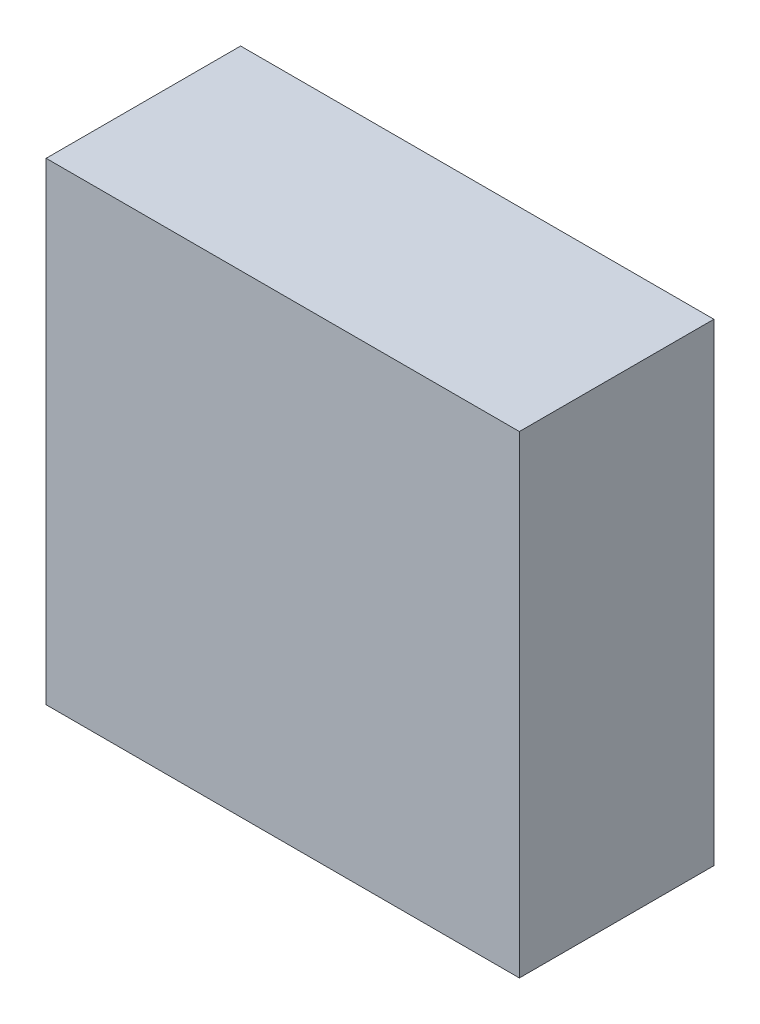
ISO-10303-21;
HEADER;
FILE_DESCRIPTION(('STEP AP214'),'2;1');
FILE_NAME('part.step','',(''),(''),'','','');
FILE_SCHEMA(('AUTOMOTIVE_DESIGN { 1 0 10303 214 1 1 1 1 }'));
ENDSEC;
DATA;
#1=APPLICATION_CONTEXT('core data for automotive mechanical design processes');
#2=APPLICATION_PROTOCOL_DEFINITION('international standard','automotive_design',2000,#1);
#3=PRODUCT_CONTEXT('',#1,'mechanical');
#4=PRODUCT('Part','Part','',(#3));
#5=PRODUCT_RELATED_PRODUCT_CATEGORY('part','',(#4));
#6=PRODUCT_DEFINITION_FORMATION('','',#4);
#7=PRODUCT_DEFINITION_CONTEXT('part definition',#1,'design');
#8=PRODUCT_DEFINITION('design','',#6,#7);
#9=PRODUCT_DEFINITION_SHAPE('','',#8);
#10=(LENGTH_UNIT() NAMED_UNIT(*) SI_UNIT(.MILLI.,.METRE.));
#11=(NAMED_UNIT(*) PLANE_ANGLE_UNIT() SI_UNIT($,.RADIAN.));
#12=(NAMED_UNIT(*) SI_UNIT($,.STERADIAN.) SOLID_ANGLE_UNIT());
#13=UNCERTAINTY_MEASURE_WITH_UNIT(LENGTH_MEASURE(1.E-05),#10,'distance_accuracy_value','');
#14=(GEOMETRIC_REPRESENTATION_CONTEXT(3) GLOBAL_UNCERTAINTY_ASSIGNED_CONTEXT((#13)) GLOBAL_UNIT_ASSIGNED_CONTEXT((#10,
#11,#12)) REPRESENTATION_CONTEXT('',''));
#15=CARTESIAN_POINT('',(0.,0.,0.));
#16=DIRECTION('',(0.,0.,1.));
#17=DIRECTION('',(1.,0.,0.));
#18=AXIS2_PLACEMENT_3D('',#15,#16,#17);
#19=CARTESIAN_POINT('',(0.,185.42,0.));
#20=DIRECTION('',(1.,0.,0.));
#21=DIRECTION('',(0.,0.,-1.));
#22=AXIS2_PLACEMENT_3D('',#19,#20,#21);
#23=PLANE('',#22);
#24=DIRECTION('',(0.,0.,1.));
#25=VECTOR('',#24,1.);
#26=CARTESIAN_POINT('',(0.,0.,0.));
#27=LINE('',#26,#25);
#28=CARTESIAN_POINT('',(0.,0.,-76.2));
#29=VERTEX_POINT('',#28);
#30=CARTESIAN_POINT('',(0.,0.,0.));
#31=VERTEX_POINT('',#30);
#32=EDGE_CURVE('E110',#29,#31,#27,.T.);
#33=ORIENTED_EDGE('',*,*,#32,.T.);
#34=DIRECTION('',(0.,-1.,0.));
#35=VECTOR('',#34,1.);
#36=CARTESIAN_POINT('',(0.,185.42,0.));
#37=LINE('',#36,#35);
#38=CARTESIAN_POINT('',(0.,185.42,0.));
#39=VERTEX_POINT('',#38);
#40=EDGE_CURVE('E11',#39,#31,#37,.T.);
#41=ORIENTED_EDGE('',*,*,#40,.F.);
#42=DIRECTION('',(0.,0.,1.));
#43=VECTOR('',#42,1.);
#44=CARTESIAN_POINT('',(0.,185.42,0.));
#45=LINE('',#44,#43);
#46=CARTESIAN_POINT('',(0.,185.42,-76.2));
#47=VERTEX_POINT('',#46);
#48=EDGE_CURVE('E98',#47,#39,#45,.T.);
#49=ORIENTED_EDGE('',*,*,#48,.F.);
#50=DIRECTION('',(0.,-1.,0.));
#51=VECTOR('',#50,1.);
#52=CARTESIAN_POINT('',(0.,185.42,-76.2));
#53=LINE('',#52,#51);
#54=EDGE_CURVE('E106',#47,#29,#53,.T.);
#55=ORIENTED_EDGE('',*,*,#54,.T.);
#56=EDGE_LOOP('',(#33,#41,#49,#55));
#57=FACE_BOUND('',#56,.T.);
#58=ADVANCED_FACE('F47',(#57),#23,.F.);
#59=CARTESIAN_POINT('',(0.,185.42,0.));
#60=DIRECTION('',(0.,0.,-1.));
#61=DIRECTION('',(-1.,0.,0.));
#62=AXIS2_PLACEMENT_3D('',#59,#60,#61);
#63=PLANE('',#62);
#64=DIRECTION('',(1.,0.,0.));
#65=VECTOR('',#64,1.);
#66=CARTESIAN_POINT('',(0.,0.,0.));
#67=LINE('',#66,#65);
#68=CARTESIAN_POINT('',(185.42,0.,0.));
#69=VERTEX_POINT('',#68);
#70=EDGE_CURVE('E102',#31,#69,#67,.T.);
#71=ORIENTED_EDGE('',*,*,#70,.T.);
#72=DIRECTION('',(0.,-1.,0.));
#73=VECTOR('',#72,1.);
#74=CARTESIAN_POINT('',(185.42,185.42,0.));
#75=LINE('',#74,#73);
#76=CARTESIAN_POINT('',(185.42,185.42,0.));
#77=VERTEX_POINT('',#76);
#78=EDGE_CURVE('E55',#77,#69,#75,.T.);
#79=ORIENTED_EDGE('',*,*,#78,.F.);
#80=DIRECTION('',(1.,0.,0.));
#81=VECTOR('',#80,1.);
#82=CARTESIAN_POINT('',(0.,185.42,0.));
#83=LINE('',#82,#81);
#84=EDGE_CURVE('E93',#39,#77,#83,.T.);
#85=ORIENTED_EDGE('',*,*,#84,.F.);
#86=ORIENTED_EDGE('',*,*,#40,.T.);
#87=EDGE_LOOP('',(#71,#79,#85,#86));
#88=FACE_BOUND('',#87,.T.);
#89=ADVANCED_FACE('F101',(#88),#63,.F.);
#90=CARTESIAN_POINT('',(185.42,185.42,0.));
#91=DIRECTION('',(-1.,0.,0.));
#92=DIRECTION('',(0.,0.,1.));
#93=AXIS2_PLACEMENT_3D('',#90,#91,#92);
#94=PLANE('',#93);
#95=DIRECTION('',(0.,0.,-1.));
#96=VECTOR('',#95,1.);
#97=CARTESIAN_POINT('',(185.42,0.,0.));
#98=LINE('',#97,#96);
#99=CARTESIAN_POINT('',(185.42,0.,-76.2));
#100=VERTEX_POINT('',#99);
#101=EDGE_CURVE('E80',#69,#100,#98,.T.);
#102=ORIENTED_EDGE('',*,*,#101,.T.);
#103=DIRECTION('',(0.,-1.,0.));
#104=VECTOR('',#103,1.);
#105=CARTESIAN_POINT('',(185.42,185.42,-76.2));
#106=LINE('',#105,#104);
#107=CARTESIAN_POINT('',(185.42,185.42,-76.2));
#108=VERTEX_POINT('',#107);
#109=EDGE_CURVE('E103',#108,#100,#106,.T.);
#110=ORIENTED_EDGE('',*,*,#109,.F.);
#111=DIRECTION('',(0.,0.,-1.));
#112=VECTOR('',#111,1.);
#113=CARTESIAN_POINT('',(185.42,185.42,0.));
#114=LINE('',#113,#112);
#115=EDGE_CURVE('E96',#77,#108,#114,.T.);
#116=ORIENTED_EDGE('',*,*,#115,.F.);
#117=ORIENTED_EDGE('',*,*,#78,.T.);
#118=EDGE_LOOP('',(#102,#110,#116,#117));
#119=FACE_BOUND('',#118,.T.);
#120=ADVANCED_FACE('F104',(#119),#94,.F.);
#121=CARTESIAN_POINT('',(0.,185.42,-76.2));
#122=DIRECTION('',(0.,0.,1.));
#123=DIRECTION('',(1.,0.,0.));
#124=AXIS2_PLACEMENT_3D('',#121,#122,#123);
#125=PLANE('',#124);
#126=DIRECTION('',(-1.,0.,0.));
#127=VECTOR('',#126,1.);
#128=CARTESIAN_POINT('',(0.,0.,-76.2));
#129=LINE('',#128,#127);
#130=EDGE_CURVE('E86',#100,#29,#129,.T.);
#131=ORIENTED_EDGE('',*,*,#130,.T.);
#132=ORIENTED_EDGE('',*,*,#54,.F.);
#133=DIRECTION('',(-1.,0.,0.));
#134=VECTOR('',#133,1.);
#135=CARTESIAN_POINT('',(0.,185.42,-76.2));
#136=LINE('',#135,#134);
#137=EDGE_CURVE('E63',#108,#47,#136,.T.);
#138=ORIENTED_EDGE('',*,*,#137,.F.);
#139=ORIENTED_EDGE('',*,*,#109,.T.);
#140=EDGE_LOOP('',(#131,#132,#138,#139));
#141=FACE_BOUND('',#140,.T.);
#142=ADVANCED_FACE('F117',(#141),#125,.F.);
#143=CARTESIAN_POINT('',(0.,185.42,0.));
#144=DIRECTION('',(0.,-1.,0.));
#145=DIRECTION('',(0.,0.,-1.));
#146=AXIS2_PLACEMENT_3D('',#143,#144,#145);
#147=PLANE('',#146);
#148=ORIENTED_EDGE('',*,*,#48,.T.);
#149=ORIENTED_EDGE('',*,*,#84,.T.);
#150=ORIENTED_EDGE('',*,*,#115,.T.);
#151=ORIENTED_EDGE('',*,*,#137,.T.);
#152=EDGE_LOOP('',(#148,#149,#150,#151));
#153=FACE_BOUND('',#152,.T.);
#154=ADVANCED_FACE('F94',(#153),#147,.F.);
#155=CARTESIAN_POINT('',(0.,0.,0.));
#156=DIRECTION('',(0.,-1.,0.));
#157=DIRECTION('',(0.,0.,-1.));
#158=AXIS2_PLACEMENT_3D('',#155,#156,#157);
#159=PLANE('',#158);
#160=ORIENTED_EDGE('',*,*,#32,.F.);
#161=ORIENTED_EDGE('',*,*,#130,.F.);
#162=ORIENTED_EDGE('',*,*,#101,.F.);
#163=ORIENTED_EDGE('',*,*,#70,.F.);
#164=EDGE_LOOP('',(#160,#161,#162,#163));
#165=FACE_BOUND('',#164,.T.);
#166=ADVANCED_FACE('F120',(#165),#159,.T.);
#167=CLOSED_SHELL('',(#58,#89,#120,#142,#154,#166));
#168=MANIFOLD_SOLID_BREP('B2',#167);
#169=ADVANCED_BREP_SHAPE_REPRESENTATION('',(#18,#168),#14);
#170=SHAPE_DEFINITION_REPRESENTATION(#9,#169);
ENDSEC;
END-ISO-10303-21;
